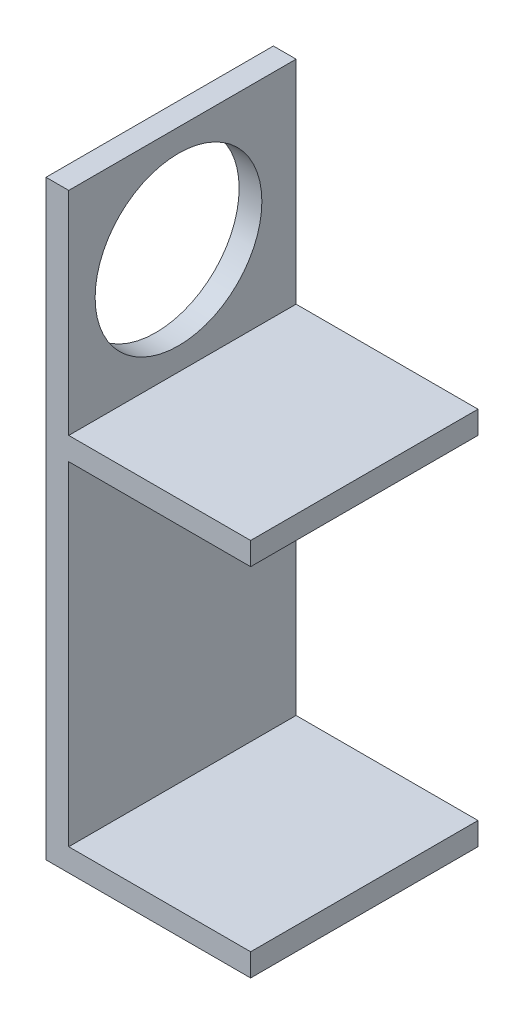
ISO-10303-21;
HEADER;
FILE_DESCRIPTION(('STEP AP214'),'2;1');
FILE_NAME('part.step','',(''),(''),'','','');
FILE_SCHEMA(('AUTOMOTIVE_DESIGN { 1 0 10303 214 1 1 1 1 }'));
ENDSEC;
DATA;
#1=APPLICATION_CONTEXT('core data for automotive mechanical design processes');
#2=APPLICATION_PROTOCOL_DEFINITION('international standard','automotive_design',2000,#1);
#3=PRODUCT_CONTEXT('',#1,'mechanical');
#4=PRODUCT('Part','Part','',(#3));
#5=PRODUCT_RELATED_PRODUCT_CATEGORY('part','',(#4));
#6=PRODUCT_DEFINITION_FORMATION('','',#4);
#7=PRODUCT_DEFINITION_CONTEXT('part definition',#1,'design');
#8=PRODUCT_DEFINITION('design','',#6,#7);
#9=PRODUCT_DEFINITION_SHAPE('','',#8);
#10=(LENGTH_UNIT() NAMED_UNIT(*) SI_UNIT(.MILLI.,.METRE.));
#11=(NAMED_UNIT(*) PLANE_ANGLE_UNIT() SI_UNIT($,.RADIAN.));
#12=(NAMED_UNIT(*) SI_UNIT($,.STERADIAN.) SOLID_ANGLE_UNIT());
#13=UNCERTAINTY_MEASURE_WITH_UNIT(LENGTH_MEASURE(1.E-05),#10,'distance_accuracy_value','');
#14=(GEOMETRIC_REPRESENTATION_CONTEXT(3) GLOBAL_UNCERTAINTY_ASSIGNED_CONTEXT((#13)) GLOBAL_UNIT_ASSIGNED_CONTEXT((#10,
#11,#12)) REPRESENTATION_CONTEXT('',''));
#15=CARTESIAN_POINT('',(0.,0.,0.));
#16=DIRECTION('',(0.,0.,1.));
#17=DIRECTION('',(1.,0.,0.));
#18=AXIS2_PLACEMENT_3D('',#15,#16,#17);
#19=CARTESIAN_POINT('',(0.,50.,30.));
#20=DIRECTION('',(0.,-1.,0.));
#21=DIRECTION('',(0.,0.,-1.));
#22=AXIS2_PLACEMENT_3D('',#19,#20,#21);
#23=PLANE('',#22);
#24=DIRECTION('',(0.,0.,-1.));
#25=VECTOR('',#24,1.);
#26=CARTESIAN_POINT('',(3.,50.,30.));
#27=LINE('',#26,#25);
#28=CARTESIAN_POINT('',(3.,50.,30.));
#29=VERTEX_POINT('',#28);
#30=CARTESIAN_POINT('',(3.,50.,0.));
#31=VERTEX_POINT('',#30);
#32=EDGE_CURVE('E56',#29,#31,#27,.T.);
#33=ORIENTED_EDGE('',*,*,#32,.F.);
#34=DIRECTION('',(-1.,0.,0.));
#35=VECTOR('',#34,1.);
#36=CARTESIAN_POINT('',(0.,50.,30.));
#37=LINE('',#36,#35);
#38=CARTESIAN_POINT('',(27.,50.,30.));
#39=VERTEX_POINT('',#38);
#40=EDGE_CURVE('E140',#39,#29,#37,.T.);
#41=ORIENTED_EDGE('',*,*,#40,.F.);
#42=DIRECTION('',(0.,0.,-1.));
#43=VECTOR('',#42,1.);
#44=CARTESIAN_POINT('',(27.,50.,30.));
#45=LINE('',#44,#43);
#46=CARTESIAN_POINT('',(27.,50.,0.));
#47=VERTEX_POINT('',#46);
#48=EDGE_CURVE('E145',#39,#47,#45,.T.);
#49=ORIENTED_EDGE('',*,*,#48,.T.);
#50=DIRECTION('',(-1.,0.,0.));
#51=VECTOR('',#50,1.);
#52=CARTESIAN_POINT('',(0.,50.,0.));
#53=LINE('',#52,#51);
#54=EDGE_CURVE('E160',#47,#31,#53,.T.);
#55=ORIENTED_EDGE('',*,*,#54,.T.);
#56=EDGE_LOOP('',(#33,#41,#49,#55));
#57=FACE_BOUND('',#56,.T.);
#58=ADVANCED_FACE('F41',(#57),#23,.F.);
#59=CARTESIAN_POINT('',(0.,0.,30.));
#60=DIRECTION('',(1.,0.,0.));
#61=DIRECTION('',(0.,0.,-1.));
#62=AXIS2_PLACEMENT_3D('',#59,#60,#61);
#63=PLANE('',#62);
#64=CARTESIAN_POINT('',(0.,64.,15.518002158619));
#65=DIRECTION('',(-1.,0.,0.));
#66=DIRECTION('',(0.,0.,1.));
#67=AXIS2_PLACEMENT_3D('',#64,#65,#66);
#68=CIRCLE('',#67,10.9999999999997);
#69=CARTESIAN_POINT('',(0.,64.,26.5180021586187));
#70=VERTEX_POINT('',#69);
#71=EDGE_CURVE('E206',#70,#70,#68,.T.);
#72=ORIENTED_EDGE('',*,*,#71,.F.);
#73=EDGE_LOOP('',(#72));
#74=FACE_BOUND('',#73,.T.);
#75=DIRECTION('',(0.,-1.,0.));
#76=VECTOR('',#75,1.);
#77=CARTESIAN_POINT('',(0.,0.,0.));
#78=LINE('',#77,#76);
#79=CARTESIAN_POINT('',(0.,78.,0.));
#80=VERTEX_POINT('',#79);
#81=CARTESIAN_POINT('',(0.,0.,0.));
#82=VERTEX_POINT('',#81);
#83=EDGE_CURVE('E146',#80,#82,#78,.T.);
#84=ORIENTED_EDGE('',*,*,#83,.T.);
#85=DIRECTION('',(0.,0.,-1.));
#86=VECTOR('',#85,1.);
#87=CARTESIAN_POINT('',(0.,0.,30.));
#88=LINE('',#87,#86);
#89=CARTESIAN_POINT('',(0.,0.,30.));
#90=VERTEX_POINT('',#89);
#91=EDGE_CURVE('E11',#90,#82,#88,.T.);
#92=ORIENTED_EDGE('',*,*,#91,.F.);
#93=DIRECTION('',(0.,-1.,0.));
#94=VECTOR('',#93,1.);
#95=CARTESIAN_POINT('',(0.,0.,30.));
#96=LINE('',#95,#94);
#97=CARTESIAN_POINT('',(0.,78.,30.));
#98=VERTEX_POINT('',#97);
#99=EDGE_CURVE('E162',#98,#90,#96,.T.);
#100=ORIENTED_EDGE('',*,*,#99,.F.);
#101=DIRECTION('',(0.,0.,1.));
#102=VECTOR('',#101,1.);
#103=CARTESIAN_POINT('',(0.,78.,30.));
#104=LINE('',#103,#102);
#105=EDGE_CURVE('E192',#80,#98,#104,.T.);
#106=ORIENTED_EDGE('',*,*,#105,.F.);
#107=EDGE_LOOP('',(#84,#92,#100,#106));
#108=FACE_BOUND('',#107,.T.);
#109=ADVANCED_FACE('F43',(#74,#108),#63,.F.);
#110=CARTESIAN_POINT('',(0.,0.,30.));
#111=DIRECTION('',(0.,1.,0.));
#112=DIRECTION('',(0.,0.,1.));
#113=AXIS2_PLACEMENT_3D('',#110,#111,#112);
#114=PLANE('',#113);
#115=DIRECTION('',(1.,0.,0.));
#116=VECTOR('',#115,1.);
#117=CARTESIAN_POINT('',(0.,0.,0.));
#118=LINE('',#117,#116);
#119=CARTESIAN_POINT('',(27.,0.,0.));
#120=VERTEX_POINT('',#119);
#121=EDGE_CURVE('E149',#82,#120,#118,.T.);
#122=ORIENTED_EDGE('',*,*,#121,.T.);
#123=DIRECTION('',(0.,0.,-1.));
#124=VECTOR('',#123,1.);
#125=CARTESIAN_POINT('',(27.,0.,30.));
#126=LINE('',#125,#124);
#127=CARTESIAN_POINT('',(27.,0.,30.));
#128=VERTEX_POINT('',#127);
#129=EDGE_CURVE('E49',#128,#120,#126,.T.);
#130=ORIENTED_EDGE('',*,*,#129,.F.);
#131=DIRECTION('',(1.,0.,0.));
#132=VECTOR('',#131,1.);
#133=CARTESIAN_POINT('',(0.,0.,30.));
#134=LINE('',#133,#132);
#135=EDGE_CURVE('E102',#90,#128,#134,.T.);
#136=ORIENTED_EDGE('',*,*,#135,.F.);
#137=ORIENTED_EDGE('',*,*,#91,.T.);
#138=EDGE_LOOP('',(#122,#130,#136,#137));
#139=FACE_BOUND('',#138,.T.);
#140=ADVANCED_FACE('F215',(#139),#114,.F.);
#141=CARTESIAN_POINT('',(27.,0.,30.));
#142=DIRECTION('',(-1.,0.,0.));
#143=DIRECTION('',(0.,0.,1.));
#144=AXIS2_PLACEMENT_3D('',#141,#142,#143);
#145=PLANE('',#144);
#146=DIRECTION('',(0.,1.,0.));
#147=VECTOR('',#146,1.);
#148=CARTESIAN_POINT('',(27.,0.,0.));
#149=LINE('',#148,#147);
#150=CARTESIAN_POINT('',(27.,3.,0.));
#151=VERTEX_POINT('',#150);
#152=EDGE_CURVE('E152',#120,#151,#149,.T.);
#153=ORIENTED_EDGE('',*,*,#152,.T.);
#154=DIRECTION('',(0.,0.,-1.));
#155=VECTOR('',#154,1.);
#156=CARTESIAN_POINT('',(27.,3.,30.));
#157=LINE('',#156,#155);
#158=CARTESIAN_POINT('',(27.,3.,30.));
#159=VERTEX_POINT('',#158);
#160=EDGE_CURVE('E166',#159,#151,#157,.T.);
#161=ORIENTED_EDGE('',*,*,#160,.F.);
#162=DIRECTION('',(0.,1.,0.));
#163=VECTOR('',#162,1.);
#164=CARTESIAN_POINT('',(27.,0.,30.));
#165=LINE('',#164,#163);
#166=EDGE_CURVE('E174',#128,#159,#165,.T.);
#167=ORIENTED_EDGE('',*,*,#166,.F.);
#168=ORIENTED_EDGE('',*,*,#129,.T.);
#169=EDGE_LOOP('',(#153,#161,#167,#168));
#170=FACE_BOUND('',#169,.T.);
#171=ADVANCED_FACE('F172',(#170),#145,.F.);
#172=CARTESIAN_POINT('',(27.,3.,30.));
#173=DIRECTION('',(0.,-1.,0.));
#174=DIRECTION('',(1.,0.,0.));
#175=AXIS2_PLACEMENT_3D('',#172,#173,#174);
#176=PLANE('',#175);
#177=DIRECTION('',(-1.,0.,0.));
#178=VECTOR('',#177,1.);
#179=CARTESIAN_POINT('',(27.,3.,0.));
#180=LINE('',#179,#178);
#181=CARTESIAN_POINT('',(3.,2.99999999999999,0.));
#182=VERTEX_POINT('',#181);
#183=EDGE_CURVE('E154',#151,#182,#180,.T.);
#184=ORIENTED_EDGE('',*,*,#183,.T.);
#185=DIRECTION('',(0.,0.,-1.));
#186=VECTOR('',#185,1.);
#187=CARTESIAN_POINT('',(3.,2.99999999999999,30.));
#188=LINE('',#187,#186);
#189=CARTESIAN_POINT('',(3.,2.99999999999999,30.));
#190=VERTEX_POINT('',#189);
#191=EDGE_CURVE('E135',#190,#182,#188,.T.);
#192=ORIENTED_EDGE('',*,*,#191,.F.);
#193=DIRECTION('',(-1.,0.,0.));
#194=VECTOR('',#193,1.);
#195=CARTESIAN_POINT('',(27.,3.,30.));
#196=LINE('',#195,#194);
#197=EDGE_CURVE('E123',#159,#190,#196,.T.);
#198=ORIENTED_EDGE('',*,*,#197,.F.);
#199=ORIENTED_EDGE('',*,*,#160,.T.);
#200=EDGE_LOOP('',(#184,#192,#198,#199));
#201=FACE_BOUND('',#200,.T.);
#202=ADVANCED_FACE('F180',(#201),#176,.F.);
#203=CARTESIAN_POINT('',(3.,47.,30.));
#204=DIRECTION('',(-1.,0.,0.));
#205=DIRECTION('',(0.,-1.,0.));
#206=AXIS2_PLACEMENT_3D('',#203,#204,#205);
#207=PLANE('',#206);
#208=DIRECTION('',(0.,1.,0.));
#209=VECTOR('',#208,1.);
#210=CARTESIAN_POINT('',(3.,47.,0.));
#211=LINE('',#210,#209);
#212=CARTESIAN_POINT('',(3.,47.,0.));
#213=VERTEX_POINT('',#212);
#214=EDGE_CURVE('E132',#182,#213,#211,.T.);
#215=ORIENTED_EDGE('',*,*,#214,.T.);
#216=DIRECTION('',(0.,0.,-1.));
#217=VECTOR('',#216,1.);
#218=CARTESIAN_POINT('',(3.,47.,30.));
#219=LINE('',#218,#217);
#220=CARTESIAN_POINT('',(3.,47.,30.));
#221=VERTEX_POINT('',#220);
#222=EDGE_CURVE('E129',#221,#213,#219,.T.);
#223=ORIENTED_EDGE('',*,*,#222,.F.);
#224=DIRECTION('',(0.,1.,0.));
#225=VECTOR('',#224,1.);
#226=CARTESIAN_POINT('',(3.,47.,30.));
#227=LINE('',#226,#225);
#228=EDGE_CURVE('E116',#190,#221,#227,.T.);
#229=ORIENTED_EDGE('',*,*,#228,.F.);
#230=ORIENTED_EDGE('',*,*,#191,.T.);
#231=EDGE_LOOP('',(#215,#223,#229,#230));
#232=FACE_BOUND('',#231,.T.);
#233=ADVANCED_FACE('F130',(#232),#207,.F.);
#234=CARTESIAN_POINT('',(27.,47.,30.));
#235=DIRECTION('',(0.,1.,0.));
#236=DIRECTION('',(0.,0.,1.));
#237=AXIS2_PLACEMENT_3D('',#234,#235,#236);
#238=PLANE('',#237);
#239=DIRECTION('',(1.,0.,0.));
#240=VECTOR('',#239,1.);
#241=CARTESIAN_POINT('',(27.,47.,0.));
#242=LINE('',#241,#240);
#243=CARTESIAN_POINT('',(27.,47.,0.));
#244=VERTEX_POINT('',#243);
#245=EDGE_CURVE('E157',#213,#244,#242,.T.);
#246=ORIENTED_EDGE('',*,*,#245,.T.);
#247=DIRECTION('',(0.,0.,-1.));
#248=VECTOR('',#247,1.);
#249=CARTESIAN_POINT('',(27.,47.,30.));
#250=LINE('',#249,#248);
#251=CARTESIAN_POINT('',(27.,47.,30.));
#252=VERTEX_POINT('',#251);
#253=EDGE_CURVE('E136',#252,#244,#250,.T.);
#254=ORIENTED_EDGE('',*,*,#253,.F.);
#255=DIRECTION('',(1.,0.,0.));
#256=VECTOR('',#255,1.);
#257=CARTESIAN_POINT('',(27.,47.,30.));
#258=LINE('',#257,#256);
#259=EDGE_CURVE('E120',#221,#252,#258,.T.);
#260=ORIENTED_EDGE('',*,*,#259,.F.);
#261=ORIENTED_EDGE('',*,*,#222,.T.);
#262=EDGE_LOOP('',(#246,#254,#260,#261));
#263=FACE_BOUND('',#262,.T.);
#264=ADVANCED_FACE('F138',(#263),#238,.F.);
#265=CARTESIAN_POINT('',(27.,47.,30.));
#266=DIRECTION('',(-1.,0.,0.));
#267=DIRECTION('',(0.,0.,1.));
#268=AXIS2_PLACEMENT_3D('',#265,#266,#267);
#269=PLANE('',#268);
#270=DIRECTION('',(0.,1.,0.));
#271=VECTOR('',#270,1.);
#272=CARTESIAN_POINT('',(27.,47.,0.));
#273=LINE('',#272,#271);
#274=EDGE_CURVE('E94',#244,#47,#273,.T.);
#275=ORIENTED_EDGE('',*,*,#274,.T.);
#276=ORIENTED_EDGE('',*,*,#48,.F.);
#277=DIRECTION('',(0.,1.,0.));
#278=VECTOR('',#277,1.);
#279=CARTESIAN_POINT('',(27.,47.,30.));
#280=LINE('',#279,#278);
#281=EDGE_CURVE('E64',#252,#39,#280,.T.);
#282=ORIENTED_EDGE('',*,*,#281,.F.);
#283=ORIENTED_EDGE('',*,*,#253,.T.);
#284=EDGE_LOOP('',(#275,#276,#282,#283));
#285=FACE_BOUND('',#284,.T.);
#286=ADVANCED_FACE('F235',(#285),#269,.F.);
#287=CARTESIAN_POINT('',(0.,0.,30.));
#288=DIRECTION('',(0.,0.,-1.));
#289=DIRECTION('',(-1.,0.,0.));
#290=AXIS2_PLACEMENT_3D('',#287,#288,#289);
#291=PLANE('',#290);
#292=ORIENTED_EDGE('',*,*,#99,.T.);
#293=ORIENTED_EDGE('',*,*,#135,.T.);
#294=ORIENTED_EDGE('',*,*,#166,.T.);
#295=ORIENTED_EDGE('',*,*,#197,.T.);
#296=ORIENTED_EDGE('',*,*,#228,.T.);
#297=ORIENTED_EDGE('',*,*,#259,.T.);
#298=ORIENTED_EDGE('',*,*,#281,.T.);
#299=ORIENTED_EDGE('',*,*,#40,.T.);
#300=DIRECTION('',(0.,-1.,0.));
#301=VECTOR('',#300,1.);
#302=CARTESIAN_POINT('',(3.,78.,30.));
#303=LINE('',#302,#301);
#304=CARTESIAN_POINT('',(3.,78.,30.));
#305=VERTEX_POINT('',#304);
#306=EDGE_CURVE('E150',#305,#29,#303,.T.);
#307=ORIENTED_EDGE('',*,*,#306,.F.);
#308=DIRECTION('',(1.,0.,0.));
#309=VECTOR('',#308,1.);
#310=CARTESIAN_POINT('',(0.,78.,30.));
#311=LINE('',#310,#309);
#312=EDGE_CURVE('E199',#98,#305,#311,.T.);
#313=ORIENTED_EDGE('',*,*,#312,.F.);
#314=EDGE_LOOP('',(#292,#293,#294,#295,#296,#297,#298,#299,#307,#313));
#315=FACE_BOUND('',#314,.T.);
#316=ADVANCED_FACE('F118',(#315),#291,.F.);
#317=CARTESIAN_POINT('',(0.,0.,0.));
#318=DIRECTION('',(0.,0.,-1.));
#319=DIRECTION('',(-1.,0.,0.));
#320=AXIS2_PLACEMENT_3D('',#317,#318,#319);
#321=PLANE('',#320);
#322=ORIENTED_EDGE('',*,*,#83,.F.);
#323=DIRECTION('',(-1.,0.,0.));
#324=VECTOR('',#323,1.);
#325=CARTESIAN_POINT('',(0.,78.,0.));
#326=LINE('',#325,#324);
#327=CARTESIAN_POINT('',(3.,78.,0.));
#328=VERTEX_POINT('',#327);
#329=EDGE_CURVE('E190',#328,#80,#326,.T.);
#330=ORIENTED_EDGE('',*,*,#329,.F.);
#331=DIRECTION('',(0.,-1.,0.));
#332=VECTOR('',#331,1.);
#333=CARTESIAN_POINT('',(3.,78.,0.));
#334=LINE('',#333,#332);
#335=EDGE_CURVE('E187',#328,#31,#334,.T.);
#336=ORIENTED_EDGE('',*,*,#335,.T.);
#337=ORIENTED_EDGE('',*,*,#54,.F.);
#338=ORIENTED_EDGE('',*,*,#274,.F.);
#339=ORIENTED_EDGE('',*,*,#245,.F.);
#340=ORIENTED_EDGE('',*,*,#214,.F.);
#341=ORIENTED_EDGE('',*,*,#183,.F.);
#342=ORIENTED_EDGE('',*,*,#152,.F.);
#343=ORIENTED_EDGE('',*,*,#121,.F.);
#344=EDGE_LOOP('',(#322,#330,#336,#337,#338,#339,#340,#341,#342,#343));
#345=FACE_BOUND('',#344,.T.);
#346=ADVANCED_FACE('F178',(#345),#321,.T.);
#347=CARTESIAN_POINT('',(3.,78.,30.));
#348=DIRECTION('',(-1.,0.,0.));
#349=DIRECTION('',(0.,0.,1.));
#350=AXIS2_PLACEMENT_3D('',#347,#348,#349);
#351=PLANE('',#350);
#352=CARTESIAN_POINT('',(3.,64.,15.518002158619));
#353=DIRECTION('',(-1.,0.,0.));
#354=DIRECTION('',(0.,0.,1.));
#355=AXIS2_PLACEMENT_3D('',#352,#353,#354);
#356=CIRCLE('',#355,10.9999999999997);
#357=CARTESIAN_POINT('',(3.,64.,26.5180021586187));
#358=VERTEX_POINT('',#357);
#359=EDGE_CURVE('E193',#358,#358,#356,.F.);
#360=ORIENTED_EDGE('',*,*,#359,.F.);
#361=EDGE_LOOP('',(#360));
#362=FACE_BOUND('',#361,.T.);
#363=ORIENTED_EDGE('',*,*,#32,.T.);
#364=ORIENTED_EDGE('',*,*,#335,.F.);
#365=DIRECTION('',(0.,0.,-1.));
#366=VECTOR('',#365,1.);
#367=CARTESIAN_POINT('',(3.,78.,30.));
#368=LINE('',#367,#366);
#369=EDGE_CURVE('E196',#305,#328,#368,.T.);
#370=ORIENTED_EDGE('',*,*,#369,.F.);
#371=ORIENTED_EDGE('',*,*,#306,.T.);
#372=EDGE_LOOP('',(#363,#364,#370,#371));
#373=FACE_BOUND('',#372,.T.);
#374=ADVANCED_FACE('F231',(#362,#373),#351,.F.);
#375=CARTESIAN_POINT('',(0.,78.,0.));
#376=DIRECTION('',(0.,-1.,0.));
#377=DIRECTION('',(0.,0.,-1.));
#378=AXIS2_PLACEMENT_3D('',#375,#376,#377);
#379=PLANE('',#378);
#380=ORIENTED_EDGE('',*,*,#105,.T.);
#381=ORIENTED_EDGE('',*,*,#312,.T.);
#382=ORIENTED_EDGE('',*,*,#369,.T.);
#383=ORIENTED_EDGE('',*,*,#329,.T.);
#384=EDGE_LOOP('',(#380,#381,#382,#383));
#385=FACE_BOUND('',#384,.T.);
#386=ADVANCED_FACE('F222',(#385),#379,.F.);
#387=CARTESIAN_POINT('',(27.001,64.,15.518002158619));
#388=DIRECTION('',(-1.,0.,0.));
#389=DIRECTION('',(0.,0.,1.));
#390=AXIS2_PLACEMENT_3D('',#387,#388,#389);
#391=CYLINDRICAL_SURFACE('',#390,10.9999999999997);
#392=CARTESIAN_POINT('',(0.,64.,26.5180021586187));
#393=CARTESIAN_POINT('',(0.0312500000000035,64.,26.5180021586187));
#394=CARTESIAN_POINT('',(0.0625000000000035,64.,26.5180021586187));
#395=CARTESIAN_POINT('',(0.125000000000004,64.,26.5180021586187));
#396=CARTESIAN_POINT('',(0.156250000000004,64.,26.5180021586187));
#397=CARTESIAN_POINT('',(0.218750000000004,64.,26.5180021586187));
#398=CARTESIAN_POINT('',(0.250000000000004,64.,26.5180021586187));
#399=CARTESIAN_POINT('',(0.312500000000004,64.,26.5180021586187));
#400=CARTESIAN_POINT('',(0.343750000000004,64.,26.5180021586187));
#401=CARTESIAN_POINT('',(0.406250000000004,64.,26.5180021586187));
#402=CARTESIAN_POINT('',(0.437500000000004,64.,26.5180021586187));
#403=CARTESIAN_POINT('',(0.500000000000004,64.,26.5180021586187));
#404=CARTESIAN_POINT('',(0.531250000000004,64.,26.5180021586187));
#405=CARTESIAN_POINT('',(0.593750000000004,64.,26.5180021586187));
#406=CARTESIAN_POINT('',(0.625000000000004,64.,26.5180021586187));
#407=CARTESIAN_POINT('',(0.687500000000004,64.,26.5180021586187));
#408=CARTESIAN_POINT('',(0.718750000000004,64.,26.5180021586187));
#409=CARTESIAN_POINT('',(0.781250000000003,64.,26.5180021586187));
#410=CARTESIAN_POINT('',(0.812500000000002,64.,26.5180021586187));
#411=CARTESIAN_POINT('',(0.875000000000001,64.,26.5180021586187));
#412=CARTESIAN_POINT('',(0.906250000000001,64.,26.5180021586187));
#413=CARTESIAN_POINT('',(0.968750000000001,64.,26.5180021586187));
#414=CARTESIAN_POINT('',(1.,64.,26.5180021586187));
#415=CARTESIAN_POINT('',(1.0625,64.,26.5180021586187));
#416=CARTESIAN_POINT('',(1.09375,64.,26.5180021586187));
#417=CARTESIAN_POINT('',(1.15625,64.,26.5180021586187));
#418=CARTESIAN_POINT('',(1.1875,64.,26.5180021586187));
#419=CARTESIAN_POINT('',(1.25,64.,26.5180021586187));
#420=CARTESIAN_POINT('',(1.28125,64.,26.5180021586187));
#421=CARTESIAN_POINT('',(1.34375,64.,26.5180021586187));
#422=CARTESIAN_POINT('',(1.375,64.,26.5180021586187));
#423=CARTESIAN_POINT('',(1.4375,64.,26.5180021586187));
#424=CARTESIAN_POINT('',(1.46875,64.,26.5180021586187));
#425=CARTESIAN_POINT('',(1.53125,64.,26.5180021586187));
#426=CARTESIAN_POINT('',(1.5625,64.,26.5180021586187));
#427=CARTESIAN_POINT('',(1.625,64.,26.5180021586187));
#428=CARTESIAN_POINT('',(1.65625,64.,26.5180021586187));
#429=CARTESIAN_POINT('',(1.71875,64.,26.5180021586187));
#430=CARTESIAN_POINT('',(1.75,64.,26.5180021586187));
#431=CARTESIAN_POINT('',(1.8125,64.,26.5180021586187));
#432=CARTESIAN_POINT('',(1.84375,64.,26.5180021586187));
#433=CARTESIAN_POINT('',(1.90625,64.,26.5180021586187));
#434=CARTESIAN_POINT('',(1.9375,64.,26.5180021586187));
#435=CARTESIAN_POINT('',(2.,64.,26.5180021586187));
#436=CARTESIAN_POINT('',(2.03125,64.,26.5180021586187));
#437=CARTESIAN_POINT('',(2.09375,64.,26.5180021586187));
#438=CARTESIAN_POINT('',(2.125,64.,26.5180021586187));
#439=CARTESIAN_POINT('',(2.1875,64.,26.5180021586187));
#440=CARTESIAN_POINT('',(2.21875,64.,26.5180021586187));
#441=CARTESIAN_POINT('',(2.28125,64.,26.5180021586187));
#442=CARTESIAN_POINT('',(2.3125,64.,26.5180021586187));
#443=CARTESIAN_POINT('',(2.375,64.,26.5180021586187));
#444=CARTESIAN_POINT('',(2.40625,64.,26.5180021586187));
#445=CARTESIAN_POINT('',(2.46875,64.,26.5180021586187));
#446=CARTESIAN_POINT('',(2.5,64.,26.5180021586187));
#447=CARTESIAN_POINT('',(2.5625,64.,26.5180021586187));
#448=CARTESIAN_POINT('',(2.59375,64.,26.5180021586187));
#449=CARTESIAN_POINT('',(2.65625,64.,26.5180021586187));
#450=CARTESIAN_POINT('',(2.6875,64.,26.5180021586187));
#451=CARTESIAN_POINT('',(2.75,64.,26.5180021586187));
#452=CARTESIAN_POINT('',(2.78125,64.,26.5180021586187));
#453=CARTESIAN_POINT('',(2.84375,64.,26.5180021586187));
#454=CARTESIAN_POINT('',(2.875,64.,26.5180021586187));
#455=CARTESIAN_POINT('',(2.9375,64.,26.5180021586187));
#456=CARTESIAN_POINT('',(2.96875,64.,26.5180021586187));
#457=CARTESIAN_POINT('',(3.,64.,26.5180021586187));
#458=B_SPLINE_CURVE_WITH_KNOTS('',3,(#392,#393,#394,#395,#396,#397,#398,#399,#400,#401,#402,
#403,#404,#405,#406,#407,#408,#409,#410,#411,#412,#413,#414,#415,#416,#417,#418,#419,#420,#421,
#422,#423,#424,#425,#426,#427,#428,#429,#430,#431,#432,#433,#434,#435,#436,#437,#438,#439,#440,
#441,#442,#443,#444,#445,#446,#447,#448,#449,#450,#451,#452,#453,#454,#455,#456,#457),
.UNSPECIFIED.,.F.,.F.,(4,2,2,2,2,2,2,2,2,2,2,2,2,2,2,2,2,2,2,2,2,2,2,2,2,2,2,2,2,2,2,2,4),(0.,
0.0937500000000001,0.1875,0.28125,0.375,0.46875,0.5625,0.656250000000001,0.750000000000001,
0.843749999999997,0.937499999999997,1.03125,1.125,1.21875,1.3125,1.40625,1.5,1.59375,1.6875,
1.78125,1.875,1.96875,2.0625,2.15625,2.25,2.34375,2.4375,2.53125,2.625,2.71875,2.8125,2.90625,
3.),.UNSPECIFIED.);
#459=EDGE_CURVE('BSEAM210',#70,#358,#458,.T.);
#460=ORIENTED_EDGE('',*,*,#71,.T.);
#461=ORIENTED_EDGE('',*,*,#359,.T.);
#462=ORIENTED_EDGE('',*,*,#459,.T.);
#463=ORIENTED_EDGE('',*,*,#459,.F.);
#464=EDGE_LOOP('',(#460,#462,#461,#463));
#465=FACE_BOUND('',#464,.T.);
#466=ADVANCED_FACE('F210',(#465),#391,.F.);
#467=CLOSED_SHELL('',(#58,#109,#140,#171,#202,#233,#264,#286,#316,#346,#374,#386,#466));
#468=MANIFOLD_SOLID_BREP('B2',#467);
#469=ADVANCED_BREP_SHAPE_REPRESENTATION('',(#18,#468),#14);
#470=SHAPE_DEFINITION_REPRESENTATION(#9,#469);
ENDSEC;
END-ISO-10303-21;
